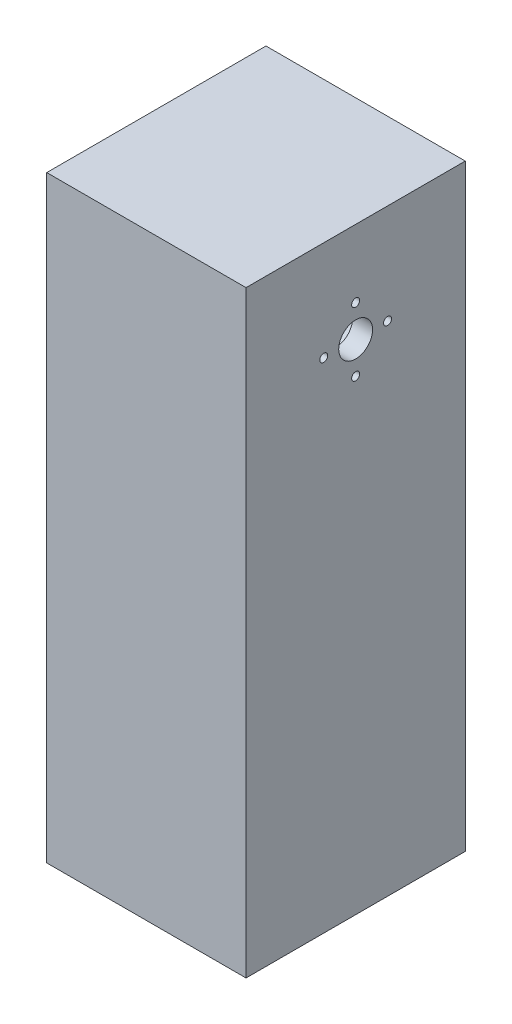
ISO-10303-21;
HEADER;
FILE_DESCRIPTION(('STEP AP214'),'2;1');
FILE_NAME('part.step','',(''),(''),'','','');
FILE_SCHEMA(('AUTOMOTIVE_DESIGN { 1 0 10303 214 1 1 1 1 }'));
ENDSEC;
DATA;
#1=APPLICATION_CONTEXT('core data for automotive mechanical design processes');
#2=APPLICATION_PROTOCOL_DEFINITION('international standard','automotive_design',2000,#1);
#3=PRODUCT_CONTEXT('',#1,'mechanical');
#4=PRODUCT('Part','Part','',(#3));
#5=PRODUCT_RELATED_PRODUCT_CATEGORY('part','',(#4));
#6=PRODUCT_DEFINITION_FORMATION('','',#4);
#7=PRODUCT_DEFINITION_CONTEXT('part definition',#1,'design');
#8=PRODUCT_DEFINITION('design','',#6,#7);
#9=PRODUCT_DEFINITION_SHAPE('','',#8);
#10=(LENGTH_UNIT() NAMED_UNIT(*) SI_UNIT(.MILLI.,.METRE.));
#11=(NAMED_UNIT(*) PLANE_ANGLE_UNIT() SI_UNIT($,.RADIAN.));
#12=(NAMED_UNIT(*) SI_UNIT($,.STERADIAN.) SOLID_ANGLE_UNIT());
#13=UNCERTAINTY_MEASURE_WITH_UNIT(LENGTH_MEASURE(1.E-05),#10,'distance_accuracy_value','');
#14=(GEOMETRIC_REPRESENTATION_CONTEXT(3) GLOBAL_UNCERTAINTY_ASSIGNED_CONTEXT((#13)) GLOBAL_UNIT_ASSIGNED_CONTEXT((#10,
#11,#12)) REPRESENTATION_CONTEXT('',''));
#15=CARTESIAN_POINT('',(0.,0.,0.));
#16=DIRECTION('',(0.,0.,1.));
#17=DIRECTION('',(1.,0.,0.));
#18=AXIS2_PLACEMENT_3D('',#15,#16,#17);
#19=CARTESIAN_POINT('',(-30.,-25.,-19.5000000000001));
#20=DIRECTION('',(1.,0.,0.));
#21=DIRECTION('',(0.,1.,0.));
#22=AXIS2_PLACEMENT_3D('',#19,#20,#21);
#23=CYLINDRICAL_SURFACE('',#22,1.);
#24=CARTESIAN_POINT('',(25.,-25.0000000000002,-19.5000000000002));
#25=DIRECTION('',(1.,0.,0.));
#26=DIRECTION('',(0.,1.,0.));
#27=AXIS2_PLACEMENT_3D('',#24,#25,#26);
#28=CIRCLE('',#27,1.);
#29=CARTESIAN_POINT('',(25.,-24.0000000000002,-19.5000000000002));
#30=VERTEX_POINT('',#29);
#31=EDGE_CURVE('E212',#30,#30,#28,.T.);
#32=ORIENTED_EDGE('',*,*,#31,.T.);
#33=EDGE_LOOP('',(#32));
#34=FACE_BOUND('',#33,.T.);
#35=CARTESIAN_POINT('',(20.,-25.,-19.5000000000001));
#36=DIRECTION('',(-1.,0.,0.));
#37=DIRECTION('',(0.,-1.,0.));
#38=AXIS2_PLACEMENT_3D('',#35,#36,#37);
#39=CIRCLE('',#38,1.);
#40=CARTESIAN_POINT('',(20.,-26.,-19.5000000000001));
#41=VERTEX_POINT('',#40);
#42=EDGE_CURVE('E203',#41,#41,#39,.F.);
#43=ORIENTED_EDGE('',*,*,#42,.F.);
#44=EDGE_LOOP('',(#43));
#45=FACE_BOUND('',#44,.T.);
#46=ADVANCED_FACE('F45',(#34,#45),#23,.F.);
#47=CARTESIAN_POINT('',(-30.,-33.,-27.5000000000002));
#48=DIRECTION('',(1.,0.,0.));
#49=DIRECTION('',(0.,1.,0.));
#50=AXIS2_PLACEMENT_3D('',#47,#48,#49);
#51=CYLINDRICAL_SURFACE('',#50,1.);
#52=CARTESIAN_POINT('',(25.,-33.,-27.5000000000004));
#53=DIRECTION('',(1.,0.,0.));
#54=DIRECTION('',(0.,1.,0.));
#55=AXIS2_PLACEMENT_3D('',#52,#53,#54);
#56=CIRCLE('',#55,1.);
#57=CARTESIAN_POINT('',(25.,-32.,-27.5000000000004));
#58=VERTEX_POINT('',#57);
#59=EDGE_CURVE('E215',#58,#58,#56,.T.);
#60=ORIENTED_EDGE('',*,*,#59,.T.);
#61=EDGE_LOOP('',(#60));
#62=FACE_BOUND('',#61,.T.);
#63=CARTESIAN_POINT('',(20.,-33.,-27.5000000000002));
#64=DIRECTION('',(-1.,0.,0.));
#65=DIRECTION('',(0.,-1.,0.));
#66=AXIS2_PLACEMENT_3D('',#63,#64,#65);
#67=CIRCLE('',#66,1.);
#68=CARTESIAN_POINT('',(20.,-34.,-27.5000000000002));
#69=VERTEX_POINT('',#68);
#70=EDGE_CURVE('E197',#69,#69,#67,.F.);
#71=ORIENTED_EDGE('',*,*,#70,.F.);
#72=EDGE_LOOP('',(#71));
#73=FACE_BOUND('',#72,.T.);
#74=ADVANCED_FACE('F150',(#62,#73),#51,.F.);
#75=CARTESIAN_POINT('',(-30.,-24.9999999999999,-35.5000000000001));
#76=DIRECTION('',(1.,0.,0.));
#77=DIRECTION('',(0.,1.,0.));
#78=AXIS2_PLACEMENT_3D('',#75,#76,#77);
#79=CYLINDRICAL_SURFACE('',#78,1.);
#80=CARTESIAN_POINT('',(25.,-24.9999999999998,-35.5000000000002));
#81=DIRECTION('',(1.,0.,0.));
#82=DIRECTION('',(0.,1.,0.));
#83=AXIS2_PLACEMENT_3D('',#80,#81,#82);
#84=CIRCLE('',#83,1.);
#85=CARTESIAN_POINT('',(25.,-23.9999999999998,-35.5000000000002));
#86=VERTEX_POINT('',#85);
#87=EDGE_CURVE('E191',#86,#86,#84,.T.);
#88=ORIENTED_EDGE('',*,*,#87,.T.);
#89=EDGE_LOOP('',(#88));
#90=FACE_BOUND('',#89,.T.);
#91=CARTESIAN_POINT('',(20.,-24.9999999999999,-35.5000000000001));
#92=DIRECTION('',(-1.,0.,0.));
#93=DIRECTION('',(0.,-1.,0.));
#94=AXIS2_PLACEMENT_3D('',#91,#92,#93);
#95=CIRCLE('',#94,1.);
#96=CARTESIAN_POINT('',(20.,-25.9999999999999,-35.5000000000001));
#97=VERTEX_POINT('',#96);
#98=EDGE_CURVE('E194',#97,#97,#95,.F.);
#99=ORIENTED_EDGE('',*,*,#98,.F.);
#100=EDGE_LOOP('',(#99));
#101=FACE_BOUND('',#100,.T.);
#102=ADVANCED_FACE('F156',(#90,#101),#79,.F.);
#103=CARTESIAN_POINT('',(-30.,-17.,-27.5));
#104=DIRECTION('',(1.,0.,0.));
#105=DIRECTION('',(0.,1.,0.));
#106=AXIS2_PLACEMENT_3D('',#103,#104,#105);
#107=CYLINDRICAL_SURFACE('',#106,1.);
#108=CARTESIAN_POINT('',(25.,-17.,-27.5));
#109=DIRECTION('',(1.,0.,0.));
#110=DIRECTION('',(0.,1.,0.));
#111=AXIS2_PLACEMENT_3D('',#108,#109,#110);
#112=CIRCLE('',#111,1.);
#113=CARTESIAN_POINT('',(25.,-16.,-27.5));
#114=VERTEX_POINT('',#113);
#115=EDGE_CURVE('E125',#114,#114,#112,.T.);
#116=ORIENTED_EDGE('',*,*,#115,.T.);
#117=EDGE_LOOP('',(#116));
#118=FACE_BOUND('',#117,.T.);
#119=CARTESIAN_POINT('',(20.,-17.,-27.5));
#120=DIRECTION('',(-1.,0.,0.));
#121=DIRECTION('',(0.,-1.,0.));
#122=AXIS2_PLACEMENT_3D('',#119,#120,#121);
#123=CIRCLE('',#122,1.);
#124=CARTESIAN_POINT('',(20.,-18.,-27.5));
#125=VERTEX_POINT('',#124);
#126=EDGE_CURVE('E198',#125,#125,#123,.F.);
#127=ORIENTED_EDGE('',*,*,#126,.F.);
#128=EDGE_LOOP('',(#127));
#129=FACE_BOUND('',#128,.T.);
#130=ADVANCED_FACE('F181',(#118,#129),#107,.F.);
#131=CARTESIAN_POINT('',(-30.,-25.,-27.5));
#132=DIRECTION('',(1.,0.,0.));
#133=DIRECTION('',(0.,1.,0.));
#134=AXIS2_PLACEMENT_3D('',#131,#132,#133);
#135=CYLINDRICAL_SURFACE('',#134,4.25);
#136=CARTESIAN_POINT('',(25.,-25.,-27.5));
#137=DIRECTION('',(1.,0.,0.));
#138=DIRECTION('',(0.,1.,0.));
#139=AXIS2_PLACEMENT_3D('',#136,#137,#138);
#140=CIRCLE('',#139,4.25);
#141=CARTESIAN_POINT('',(25.,-20.75,-27.5));
#142=VERTEX_POINT('',#141);
#143=EDGE_CURVE('E221',#142,#142,#140,.T.);
#144=ORIENTED_EDGE('',*,*,#143,.T.);
#145=EDGE_LOOP('',(#144));
#146=FACE_BOUND('',#145,.T.);
#147=CARTESIAN_POINT('',(20.,-25.,-27.5));
#148=DIRECTION('',(-1.,0.,0.));
#149=DIRECTION('',(0.,-1.,0.));
#150=AXIS2_PLACEMENT_3D('',#147,#148,#149);
#151=CIRCLE('',#150,4.25);
#152=CARTESIAN_POINT('',(20.,-29.25,-27.5));
#153=VERTEX_POINT('',#152);
#154=EDGE_CURVE('E49',#153,#153,#151,.F.);
#155=ORIENTED_EDGE('',*,*,#154,.F.);
#156=EDGE_LOOP('',(#155));
#157=FACE_BOUND('',#156,.T.);
#158=ADVANCED_FACE('F146',(#146,#157),#135,.F.);
#159=CARTESIAN_POINT('',(-25.,0.,-55.));
#160=DIRECTION('',(-1.,0.,0.));
#161=DIRECTION('',(0.,-1.,0.));
#162=AXIS2_PLACEMENT_3D('',#159,#160,#161);
#163=PLANE('',#162);
#164=CARTESIAN_POINT('',(-25.,-25.,-27.5));
#165=DIRECTION('',(-1.,0.,0.));
#166=DIRECTION('',(0.,-1.,0.));
#167=AXIS2_PLACEMENT_3D('',#164,#165,#166);
#168=CIRCLE('',#167,10.25);
#169=CARTESIAN_POINT('',(-25.,-35.25,-27.5));
#170=VERTEX_POINT('',#169);
#171=EDGE_CURVE('E249',#170,#170,#168,.T.);
#172=ORIENTED_EDGE('',*,*,#171,.F.);
#173=EDGE_LOOP('',(#172));
#174=FACE_BOUND('',#173,.T.);
#175=DIRECTION('',(0.,-1.,0.));
#176=VECTOR('',#175,1.);
#177=CARTESIAN_POINT('',(-25.,0.,0.));
#178=LINE('',#177,#176);
#179=CARTESIAN_POINT('',(-25.,0.,0.));
#180=VERTEX_POINT('',#179);
#181=CARTESIAN_POINT('',(-25.,-150.,0.));
#182=VERTEX_POINT('',#181);
#183=EDGE_CURVE('E120',#180,#182,#178,.T.);
#184=ORIENTED_EDGE('',*,*,#183,.F.);
#185=DIRECTION('',(0.,0.,1.));
#186=VECTOR('',#185,1.);
#187=CARTESIAN_POINT('',(-25.,0.,-55.));
#188=LINE('',#187,#186);
#189=CARTESIAN_POINT('',(-25.,0.,-55.));
#190=VERTEX_POINT('',#189);
#191=EDGE_CURVE('E11',#190,#180,#188,.T.);
#192=ORIENTED_EDGE('',*,*,#191,.F.);
#193=DIRECTION('',(0.,-1.,0.));
#194=VECTOR('',#193,1.);
#195=CARTESIAN_POINT('',(-25.,0.,-55.));
#196=LINE('',#195,#194);
#197=CARTESIAN_POINT('',(-25.,-150.,-55.));
#198=VERTEX_POINT('',#197);
#199=EDGE_CURVE('E111',#190,#198,#196,.T.);
#200=ORIENTED_EDGE('',*,*,#199,.T.);
#201=DIRECTION('',(0.,0.,1.));
#202=VECTOR('',#201,1.);
#203=CARTESIAN_POINT('',(-25.,-150.,-55.));
#204=LINE('',#203,#202);
#205=EDGE_CURVE('E90',#198,#182,#204,.T.);
#206=ORIENTED_EDGE('',*,*,#205,.T.);
#207=EDGE_LOOP('',(#184,#192,#200,#206));
#208=FACE_BOUND('',#207,.T.);
#209=ADVANCED_FACE('F47',(#174,#208),#163,.T.);
#210=CARTESIAN_POINT('',(-25.,0.,-55.));
#211=DIRECTION('',(0.,1.,0.));
#212=DIRECTION('',(0.,0.,1.));
#213=AXIS2_PLACEMENT_3D('',#210,#211,#212);
#214=PLANE('',#213);
#215=DIRECTION('',(-1.,0.,0.));
#216=VECTOR('',#215,1.);
#217=CARTESIAN_POINT('',(-25.,0.,0.));
#218=LINE('',#217,#216);
#219=CARTESIAN_POINT('',(25.,0.,0.));
#220=VERTEX_POINT('',#219);
#221=EDGE_CURVE('E114',#220,#180,#218,.T.);
#222=ORIENTED_EDGE('',*,*,#221,.F.);
#223=DIRECTION('',(0.,0.,1.));
#224=VECTOR('',#223,1.);
#225=CARTESIAN_POINT('',(25.,0.,-55.));
#226=LINE('',#225,#224);
#227=CARTESIAN_POINT('',(25.,0.,-55.));
#228=VERTEX_POINT('',#227);
#229=EDGE_CURVE('E56',#228,#220,#226,.T.);
#230=ORIENTED_EDGE('',*,*,#229,.F.);
#231=DIRECTION('',(-1.,0.,0.));
#232=VECTOR('',#231,1.);
#233=CARTESIAN_POINT('',(-25.,0.,-55.));
#234=LINE('',#233,#232);
#235=EDGE_CURVE('E106',#228,#190,#234,.T.);
#236=ORIENTED_EDGE('',*,*,#235,.T.);
#237=ORIENTED_EDGE('',*,*,#191,.T.);
#238=EDGE_LOOP('',(#222,#230,#236,#237));
#239=FACE_BOUND('',#238,.T.);
#240=ADVANCED_FACE('F137',(#239),#214,.T.);
#241=CARTESIAN_POINT('',(25.,0.,-55.));
#242=DIRECTION('',(1.,0.,0.));
#243=DIRECTION('',(0.,1.,0.));
#244=AXIS2_PLACEMENT_3D('',#241,#242,#243);
#245=PLANE('',#244);
#246=DIRECTION('',(0.,1.,0.));
#247=VECTOR('',#246,1.);
#248=CARTESIAN_POINT('',(25.,0.,0.));
#249=LINE('',#248,#247);
#250=CARTESIAN_POINT('',(25.,-150.,0.));
#251=VERTEX_POINT('',#250);
#252=EDGE_CURVE('E99',#251,#220,#249,.T.);
#253=ORIENTED_EDGE('',*,*,#252,.F.);
#254=DIRECTION('',(0.,0.,1.));
#255=VECTOR('',#254,1.);
#256=CARTESIAN_POINT('',(25.,-150.,-55.));
#257=LINE('',#256,#255);
#258=CARTESIAN_POINT('',(25.,-150.,-55.));
#259=VERTEX_POINT('',#258);
#260=EDGE_CURVE('E93',#259,#251,#257,.T.);
#261=ORIENTED_EDGE('',*,*,#260,.F.);
#262=DIRECTION('',(0.,1.,0.));
#263=VECTOR('',#262,1.);
#264=CARTESIAN_POINT('',(25.,0.,-55.));
#265=LINE('',#264,#263);
#266=EDGE_CURVE('E97',#259,#228,#265,.T.);
#267=ORIENTED_EDGE('',*,*,#266,.T.);
#268=ORIENTED_EDGE('',*,*,#229,.T.);
#269=EDGE_LOOP('',(#253,#261,#267,#268));
#270=FACE_BOUND('',#269,.T.);
#271=ORIENTED_EDGE('',*,*,#59,.F.);
#272=EDGE_LOOP('',(#271));
#273=FACE_BOUND('',#272,.T.);
#274=ORIENTED_EDGE('',*,*,#143,.F.);
#275=EDGE_LOOP('',(#274));
#276=FACE_BOUND('',#275,.T.);
#277=ORIENTED_EDGE('',*,*,#115,.F.);
#278=EDGE_LOOP('',(#277));
#279=FACE_BOUND('',#278,.T.);
#280=ORIENTED_EDGE('',*,*,#87,.F.);
#281=EDGE_LOOP('',(#280));
#282=FACE_BOUND('',#281,.T.);
#283=ORIENTED_EDGE('',*,*,#31,.F.);
#284=EDGE_LOOP('',(#283));
#285=FACE_BOUND('',#284,.T.);
#286=ADVANCED_FACE('F95',(#270,#273,#276,#279,#282,#285),#245,.T.);
#287=CARTESIAN_POINT('',(-25.,-150.,-55.));
#288=DIRECTION('',(0.,-1.,0.));
#289=DIRECTION('',(0.,0.,-1.));
#290=AXIS2_PLACEMENT_3D('',#287,#288,#289);
#291=PLANE('',#290);
#292=DIRECTION('',(1.,0.,0.));
#293=VECTOR('',#292,1.);
#294=CARTESIAN_POINT('',(-25.,-150.,0.));
#295=LINE('',#294,#293);
#296=EDGE_CURVE('E124',#182,#251,#295,.T.);
#297=ORIENTED_EDGE('',*,*,#296,.F.);
#298=ORIENTED_EDGE('',*,*,#205,.F.);
#299=DIRECTION('',(1.,0.,0.));
#300=VECTOR('',#299,1.);
#301=CARTESIAN_POINT('',(-25.,-150.,-55.));
#302=LINE('',#301,#300);
#303=EDGE_CURVE('E105',#198,#259,#302,.T.);
#304=ORIENTED_EDGE('',*,*,#303,.T.);
#305=ORIENTED_EDGE('',*,*,#260,.T.);
#306=EDGE_LOOP('',(#297,#298,#304,#305));
#307=FACE_BOUND('',#306,.T.);
#308=ADVANCED_FACE('F109',(#307),#291,.T.);
#309=CARTESIAN_POINT('',(0.,0.,-55.));
#310=DIRECTION('',(0.,0.,1.));
#311=DIRECTION('',(1.,0.,0.));
#312=AXIS2_PLACEMENT_3D('',#309,#310,#311);
#313=PLANE('',#312);
#314=ORIENTED_EDGE('',*,*,#199,.F.);
#315=ORIENTED_EDGE('',*,*,#235,.F.);
#316=ORIENTED_EDGE('',*,*,#266,.F.);
#317=ORIENTED_EDGE('',*,*,#303,.F.);
#318=EDGE_LOOP('',(#314,#315,#316,#317));
#319=FACE_BOUND('',#318,.T.);
#320=ADVANCED_FACE('F104',(#319),#313,.F.);
#321=CARTESIAN_POINT('',(0.,0.,0.));
#322=DIRECTION('',(0.,0.,1.));
#323=DIRECTION('',(1.,0.,0.));
#324=AXIS2_PLACEMENT_3D('',#321,#322,#323);
#325=PLANE('',#324);
#326=ORIENTED_EDGE('',*,*,#183,.T.);
#327=ORIENTED_EDGE('',*,*,#296,.T.);
#328=ORIENTED_EDGE('',*,*,#252,.T.);
#329=ORIENTED_EDGE('',*,*,#221,.T.);
#330=EDGE_LOOP('',(#326,#327,#328,#329));
#331=FACE_BOUND('',#330,.T.);
#332=ADVANCED_FACE('F136',(#331),#325,.T.);
#333=CARTESIAN_POINT('',(20.,-25.,-27.5));
#334=DIRECTION('',(-1.,0.,0.));
#335=DIRECTION('',(0.,-1.,0.));
#336=AXIS2_PLACEMENT_3D('',#333,#334,#335);
#337=PLANE('',#336);
#338=CARTESIAN_POINT('',(20.,-25.,-27.5));
#339=DIRECTION('',(-1.,0.,0.));
#340=DIRECTION('',(0.,-1.,0.));
#341=AXIS2_PLACEMENT_3D('',#338,#339,#340);
#342=CIRCLE('',#341,10.25);
#343=CARTESIAN_POINT('',(20.,-35.25,-27.5));
#344=VERTEX_POINT('',#343);
#345=EDGE_CURVE('E247',#344,#344,#342,.T.);
#346=ORIENTED_EDGE('',*,*,#345,.T.);
#347=EDGE_LOOP('',(#346));
#348=FACE_BOUND('',#347,.T.);
#349=ORIENTED_EDGE('',*,*,#154,.T.);
#350=EDGE_LOOP('',(#349));
#351=FACE_BOUND('',#350,.T.);
#352=ORIENTED_EDGE('',*,*,#126,.T.);
#353=EDGE_LOOP('',(#352));
#354=FACE_BOUND('',#353,.T.);
#355=ORIENTED_EDGE('',*,*,#98,.T.);
#356=EDGE_LOOP('',(#355));
#357=FACE_BOUND('',#356,.T.);
#358=ORIENTED_EDGE('',*,*,#70,.T.);
#359=EDGE_LOOP('',(#358));
#360=FACE_BOUND('',#359,.T.);
#361=ORIENTED_EDGE('',*,*,#42,.T.);
#362=EDGE_LOOP('',(#361));
#363=FACE_BOUND('',#362,.T.);
#364=ADVANCED_FACE('F166',(#348,#351,#354,#357,#360,#363),#337,.T.);
#365=CARTESIAN_POINT('',(20.,-25.,-27.5));
#366=DIRECTION('',(-1.,0.,0.));
#367=DIRECTION('',(0.,-1.,0.));
#368=AXIS2_PLACEMENT_3D('',#365,#366,#367);
#369=CYLINDRICAL_SURFACE('',#368,10.25);
#370=ORIENTED_EDGE('',*,*,#345,.F.);
#371=EDGE_LOOP('',(#370));
#372=FACE_BOUND('',#371,.T.);
#373=ORIENTED_EDGE('',*,*,#171,.T.);
#374=EDGE_LOOP('',(#373));
#375=FACE_BOUND('',#374,.T.);
#376=ADVANCED_FACE('F170',(#372,#375),#369,.F.);
#377=CLOSED_SHELL('',(#46,#74,#102,#130,#158,#209,#240,#286,#308,#320,#332,#364,#376));
#378=MANIFOLD_SOLID_BREP('B2',#377);
#379=ADVANCED_BREP_SHAPE_REPRESENTATION('',(#18,#378),#14);
#380=SHAPE_DEFINITION_REPRESENTATION(#9,#379);
ENDSEC;
END-ISO-10303-21;
